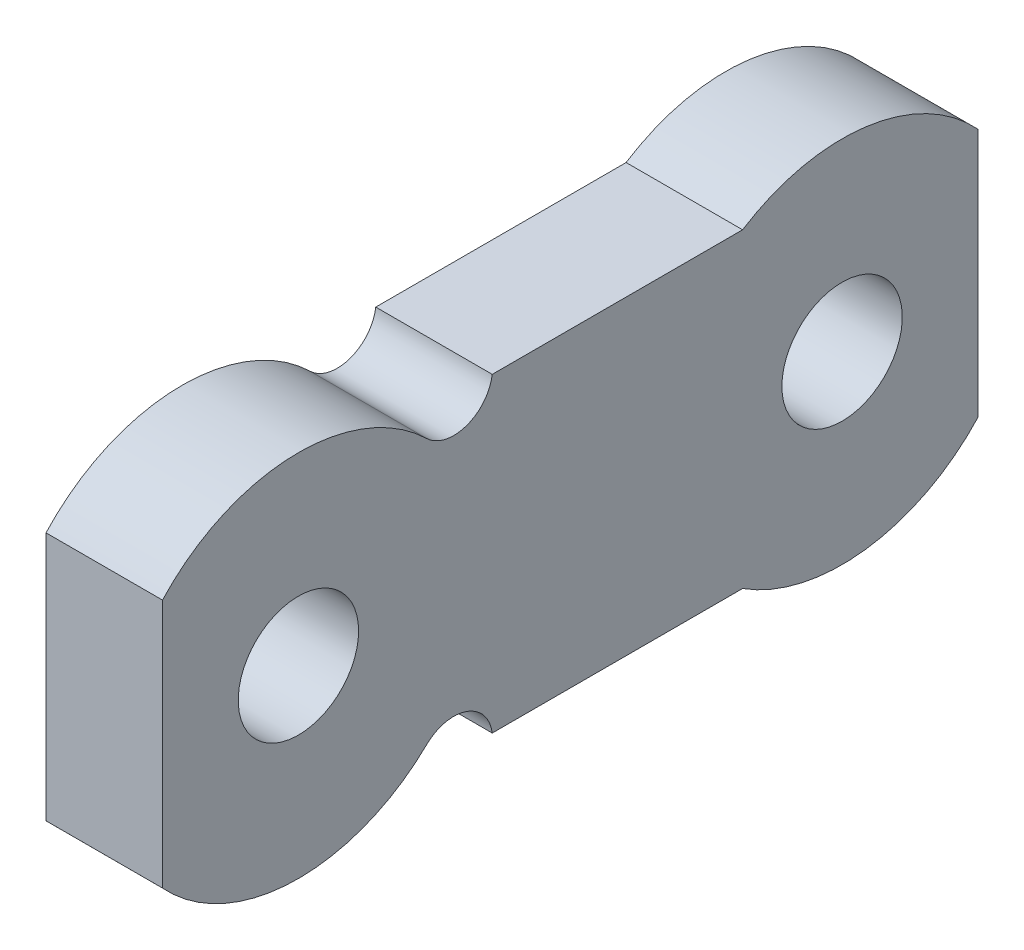
ISO-10303-21;
HEADER;
FILE_DESCRIPTION(('STEP AP214'),'2;1');
FILE_NAME('part.step','',(''),(''),'','','');
FILE_SCHEMA(('AUTOMOTIVE_DESIGN { 1 0 10303 214 1 1 1 1 }'));
ENDSEC;
DATA;
#1=APPLICATION_CONTEXT('core data for automotive mechanical design processes');
#2=APPLICATION_PROTOCOL_DEFINITION('international standard','automotive_design',2000,#1);
#3=PRODUCT_CONTEXT('',#1,'mechanical');
#4=PRODUCT('Part','Part','',(#3));
#5=PRODUCT_RELATED_PRODUCT_CATEGORY('part','',(#4));
#6=PRODUCT_DEFINITION_FORMATION('','',#4);
#7=PRODUCT_DEFINITION_CONTEXT('part definition',#1,'design');
#8=PRODUCT_DEFINITION('design','',#6,#7);
#9=PRODUCT_DEFINITION_SHAPE('','',#8);
#10=(LENGTH_UNIT() NAMED_UNIT(*) SI_UNIT(.MILLI.,.METRE.));
#11=(NAMED_UNIT(*) PLANE_ANGLE_UNIT() SI_UNIT($,.RADIAN.));
#12=(NAMED_UNIT(*) SI_UNIT($,.STERADIAN.) SOLID_ANGLE_UNIT());
#13=UNCERTAINTY_MEASURE_WITH_UNIT(LENGTH_MEASURE(1.E-05),#10,'distance_accuracy_value','');
#14=(GEOMETRIC_REPRESENTATION_CONTEXT(3) GLOBAL_UNCERTAINTY_ASSIGNED_CONTEXT((#13)) GLOBAL_UNIT_ASSIGNED_CONTEXT((#10,
#11,#12)) REPRESENTATION_CONTEXT('',''));
#15=CARTESIAN_POINT('',(0.,0.,0.));
#16=DIRECTION('',(0.,0.,1.));
#17=DIRECTION('',(1.,0.,0.));
#18=AXIS2_PLACEMENT_3D('',#15,#16,#17);
#19=CARTESIAN_POINT('',(3.,-4.13067791046458,3.));
#20=DIRECTION('',(-1.,0.,0.));
#21=DIRECTION('',(0.,0.,1.));
#22=AXIS2_PLACEMENT_3D('',#19,#20,#21);
#23=PLANE('',#22);
#24=CARTESIAN_POINT('',(3.,-4.13067791046458,3.));
#25=DIRECTION('',(-1.,0.,0.));
#26=DIRECTION('',(0.,0.,1.));
#27=AXIS2_PLACEMENT_3D('',#24,#25,#26);
#28=CIRCLE('',#27,1.);
#29=CARTESIAN_POINT('',(3.,-3.41229914342726,3.69565217391304));
#30=VERTEX_POINT('',#29);
#31=CARTESIAN_POINT('',(3.,-4.,2.00857512452198));
#32=VERTEX_POINT('',#31);
#33=EDGE_CURVE('E162',#30,#32,#28,.T.);
#34=ORIENTED_EDGE('',*,*,#33,.T.);
#35=DIRECTION('',(0.,0.,-1.));
#36=VECTOR('',#35,1.);
#37=CARTESIAN_POINT('',(3.,-4.,2.00857512452198));
#38=LINE('',#37,#36);
#39=CARTESIAN_POINT('',(3.,-4.,-4.4382623085101));
#40=VERTEX_POINT('',#39);
#41=EDGE_CURVE('E100',#32,#40,#38,.T.);
#42=ORIENTED_EDGE('',*,*,#41,.T.);
#43=CARTESIAN_POINT('',(3.,0.,-7.));
#44=DIRECTION('',(1.,0.,0.));
#45=DIRECTION('',(0.,0.,-1.));
#46=AXIS2_PLACEMENT_3D('',#43,#44,#45);
#47=CIRCLE('',#46,4.75);
#48=CARTESIAN_POINT('',(3.,-3.21130814466629,-10.5));
#49=VERTEX_POINT('',#48);
#50=EDGE_CURVE('E183',#40,#49,#47,.T.);
#51=ORIENTED_EDGE('',*,*,#50,.T.);
#52=DIRECTION('',(0.,1.,0.));
#53=VECTOR('',#52,1.);
#54=CARTESIAN_POINT('',(3.,3.21130814466628,-10.5));
#55=LINE('',#54,#53);
#56=CARTESIAN_POINT('',(3.,3.21130814466628,-10.5));
#57=VERTEX_POINT('',#56);
#58=EDGE_CURVE('E202',#49,#57,#55,.T.);
#59=ORIENTED_EDGE('',*,*,#58,.T.);
#60=CARTESIAN_POINT('',(3.,0.,-7.));
#61=DIRECTION('',(1.,0.,0.));
#62=DIRECTION('',(0.,0.,-1.));
#63=AXIS2_PLACEMENT_3D('',#60,#61,#62);
#64=CIRCLE('',#63,4.75);
#65=CARTESIAN_POINT('',(3.,4.,-4.4382623085101));
#66=VERTEX_POINT('',#65);
#67=EDGE_CURVE('E199',#57,#66,#64,.T.);
#68=ORIENTED_EDGE('',*,*,#67,.T.);
#69=DIRECTION('',(0.,0.,1.));
#70=VECTOR('',#69,1.);
#71=CARTESIAN_POINT('',(3.,4.,2.00857512452198));
#72=LINE('',#71,#70);
#73=CARTESIAN_POINT('',(3.,4.,2.00857512452198));
#74=VERTEX_POINT('',#73);
#75=EDGE_CURVE('E201',#66,#74,#72,.T.);
#76=ORIENTED_EDGE('',*,*,#75,.T.);
#77=CARTESIAN_POINT('',(3.,4.13067791046458,3.));
#78=DIRECTION('',(-1.,0.,0.));
#79=DIRECTION('',(0.,0.,-1.));
#80=AXIS2_PLACEMENT_3D('',#77,#78,#79);
#81=CIRCLE('',#80,1.);
#82=CARTESIAN_POINT('',(3.,3.41229914342726,3.69565217391304));
#83=VERTEX_POINT('',#82);
#84=EDGE_CURVE('E125',#74,#83,#81,.T.);
#85=ORIENTED_EDGE('',*,*,#84,.T.);
#86=CARTESIAN_POINT('',(3.,0.,7.));
#87=DIRECTION('',(1.,0.,0.));
#88=DIRECTION('',(0.,0.,-1.));
#89=AXIS2_PLACEMENT_3D('',#86,#87,#88);
#90=CIRCLE('',#89,4.75);
#91=CARTESIAN_POINT('',(3.,3.21130814466628,10.5));
#92=VERTEX_POINT('',#91);
#93=EDGE_CURVE('E119',#83,#92,#90,.T.);
#94=ORIENTED_EDGE('',*,*,#93,.T.);
#95=DIRECTION('',(0.,-1.,0.));
#96=VECTOR('',#95,1.);
#97=CARTESIAN_POINT('',(3.,3.21130814466628,10.5));
#98=LINE('',#97,#96);
#99=CARTESIAN_POINT('',(3.,-3.21130814466628,10.5));
#100=VERTEX_POINT('',#99);
#101=EDGE_CURVE('E123',#92,#100,#98,.T.);
#102=ORIENTED_EDGE('',*,*,#101,.T.);
#103=CARTESIAN_POINT('',(3.,0.,7.));
#104=DIRECTION('',(1.,0.,0.));
#105=DIRECTION('',(0.,0.,-1.));
#106=AXIS2_PLACEMENT_3D('',#103,#104,#105);
#107=CIRCLE('',#106,4.75);
#108=EDGE_CURVE('E51',#100,#30,#107,.T.);
#109=ORIENTED_EDGE('',*,*,#108,.T.);
#110=EDGE_LOOP('',(#34,#42,#51,#59,#68,#76,#85,#94,#102,#109));
#111=FACE_BOUND('',#110,.T.);
#112=CARTESIAN_POINT('',(3.,0.,7.));
#113=DIRECTION('',(1.,0.,0.));
#114=DIRECTION('',(0.,0.,-1.));
#115=AXIS2_PLACEMENT_3D('',#112,#113,#114);
#116=CIRCLE('',#115,1.55);
#117=CARTESIAN_POINT('',(3.,0.,5.45));
#118=VERTEX_POINT('',#117);
#119=EDGE_CURVE('E147',#118,#118,#116,.T.);
#120=ORIENTED_EDGE('',*,*,#119,.F.);
#121=EDGE_LOOP('',(#120));
#122=FACE_BOUND('',#121,.T.);
#123=CARTESIAN_POINT('',(3.,0.,-7.));
#124=DIRECTION('',(1.,0.,0.));
#125=DIRECTION('',(0.,0.,1.));
#126=AXIS2_PLACEMENT_3D('',#123,#124,#125);
#127=CIRCLE('',#126,1.55);
#128=CARTESIAN_POINT('',(3.,0.,-5.45));
#129=VERTEX_POINT('',#128);
#130=EDGE_CURVE('E213',#129,#129,#127,.T.);
#131=ORIENTED_EDGE('',*,*,#130,.F.);
#132=EDGE_LOOP('',(#131));
#133=FACE_BOUND('',#132,.T.);
#134=ADVANCED_FACE('F34',(#111,#122,#133),#23,.F.);
#135=CARTESIAN_POINT('',(0.,-4.13067791046458,3.));
#136=DIRECTION('',(-1.,0.,0.));
#137=DIRECTION('',(0.,0.,1.));
#138=AXIS2_PLACEMENT_3D('',#135,#136,#137);
#139=PLANE('',#138);
#140=CARTESIAN_POINT('',(0.,0.,7.));
#141=DIRECTION('',(1.,0.,0.));
#142=DIRECTION('',(0.,0.,-1.));
#143=AXIS2_PLACEMENT_3D('',#140,#141,#142);
#144=CIRCLE('',#143,1.55);
#145=CARTESIAN_POINT('',(0.,0.,5.45));
#146=VERTEX_POINT('',#145);
#147=EDGE_CURVE('E210',#146,#146,#144,.T.);
#148=ORIENTED_EDGE('',*,*,#147,.T.);
#149=EDGE_LOOP('',(#148));
#150=FACE_BOUND('',#149,.T.);
#151=CARTESIAN_POINT('',(0.,-4.13067791046458,3.));
#152=DIRECTION('',(-1.,0.,0.));
#153=DIRECTION('',(0.,0.,1.));
#154=AXIS2_PLACEMENT_3D('',#151,#152,#153);
#155=CIRCLE('',#154,1.);
#156=CARTESIAN_POINT('',(0.,-3.41229914342726,3.69565217391304));
#157=VERTEX_POINT('',#156);
#158=CARTESIAN_POINT('',(0.,-4.,2.00857512452198));
#159=VERTEX_POINT('',#158);
#160=EDGE_CURVE('E143',#157,#159,#155,.T.);
#161=ORIENTED_EDGE('',*,*,#160,.F.);
#162=CARTESIAN_POINT('',(0.,0.,7.));
#163=DIRECTION('',(1.,0.,0.));
#164=DIRECTION('',(0.,0.,-1.));
#165=AXIS2_PLACEMENT_3D('',#162,#163,#164);
#166=CIRCLE('',#165,4.75);
#167=CARTESIAN_POINT('',(0.,-3.21130814466628,10.5));
#168=VERTEX_POINT('',#167);
#169=EDGE_CURVE('E92',#168,#157,#166,.T.);
#170=ORIENTED_EDGE('',*,*,#169,.F.);
#171=DIRECTION('',(0.,-1.,0.));
#172=VECTOR('',#171,1.);
#173=CARTESIAN_POINT('',(0.,3.21130814466628,10.5));
#174=LINE('',#173,#172);
#175=CARTESIAN_POINT('',(0.,3.21130814466628,10.5));
#176=VERTEX_POINT('',#175);
#177=EDGE_CURVE('E86',#176,#168,#174,.T.);
#178=ORIENTED_EDGE('',*,*,#177,.F.);
#179=CARTESIAN_POINT('',(0.,0.,7.));
#180=DIRECTION('',(1.,0.,0.));
#181=DIRECTION('',(0.,0.,-1.));
#182=AXIS2_PLACEMENT_3D('',#179,#180,#181);
#183=CIRCLE('',#182,4.75);
#184=CARTESIAN_POINT('',(0.,3.41229914342726,3.69565217391304));
#185=VERTEX_POINT('',#184);
#186=EDGE_CURVE('E133',#185,#176,#183,.T.);
#187=ORIENTED_EDGE('',*,*,#186,.F.);
#188=CARTESIAN_POINT('',(0.,4.13067791046458,3.));
#189=DIRECTION('',(-1.,0.,0.));
#190=DIRECTION('',(0.,0.,-1.));
#191=AXIS2_PLACEMENT_3D('',#188,#189,#190);
#192=CIRCLE('',#191,1.);
#193=CARTESIAN_POINT('',(0.,4.,2.00857512452198));
#194=VERTEX_POINT('',#193);
#195=EDGE_CURVE('E157',#194,#185,#192,.T.);
#196=ORIENTED_EDGE('',*,*,#195,.F.);
#197=DIRECTION('',(0.,0.,1.));
#198=VECTOR('',#197,1.);
#199=CARTESIAN_POINT('',(0.,4.,2.00857512452198));
#200=LINE('',#199,#198);
#201=CARTESIAN_POINT('',(0.,4.,-4.4382623085101));
#202=VERTEX_POINT('',#201);
#203=EDGE_CURVE('E155',#202,#194,#200,.T.);
#204=ORIENTED_EDGE('',*,*,#203,.F.);
#205=CARTESIAN_POINT('',(0.,0.,-7.));
#206=DIRECTION('',(1.,0.,0.));
#207=DIRECTION('',(0.,0.,-1.));
#208=AXIS2_PLACEMENT_3D('',#205,#206,#207);
#209=CIRCLE('',#208,4.75);
#210=CARTESIAN_POINT('',(0.,3.21130814466628,-10.5));
#211=VERTEX_POINT('',#210);
#212=EDGE_CURVE('E153',#211,#202,#209,.T.);
#213=ORIENTED_EDGE('',*,*,#212,.F.);
#214=DIRECTION('',(0.,1.,0.));
#215=VECTOR('',#214,1.);
#216=CARTESIAN_POINT('',(0.,3.21130814466628,-10.5));
#217=LINE('',#216,#215);
#218=CARTESIAN_POINT('',(0.,-3.21130814466629,-10.5));
#219=VERTEX_POINT('',#218);
#220=EDGE_CURVE('E151',#219,#211,#217,.T.);
#221=ORIENTED_EDGE('',*,*,#220,.F.);
#222=CARTESIAN_POINT('',(0.,0.,-7.));
#223=DIRECTION('',(1.,0.,0.));
#224=DIRECTION('',(0.,0.,-1.));
#225=AXIS2_PLACEMENT_3D('',#222,#223,#224);
#226=CIRCLE('',#225,4.75);
#227=CARTESIAN_POINT('',(0.,-4.,-4.4382623085101));
#228=VERTEX_POINT('',#227);
#229=EDGE_CURVE('E149',#228,#219,#226,.T.);
#230=ORIENTED_EDGE('',*,*,#229,.F.);
#231=DIRECTION('',(0.,0.,-1.));
#232=VECTOR('',#231,1.);
#233=CARTESIAN_POINT('',(0.,-4.,2.00857512452198));
#234=LINE('',#233,#232);
#235=EDGE_CURVE('E146',#159,#228,#234,.T.);
#236=ORIENTED_EDGE('',*,*,#235,.F.);
#237=EDGE_LOOP('',(#161,#170,#178,#187,#196,#204,#213,#221,#230,#236));
#238=FACE_BOUND('',#237,.T.);
#239=CARTESIAN_POINT('',(0.,0.,-7.));
#240=DIRECTION('',(1.,0.,0.));
#241=DIRECTION('',(0.,0.,1.));
#242=AXIS2_PLACEMENT_3D('',#239,#240,#241);
#243=CIRCLE('',#242,1.55);
#244=CARTESIAN_POINT('',(0.,0.,-5.45));
#245=VERTEX_POINT('',#244);
#246=EDGE_CURVE('E216',#245,#245,#243,.T.);
#247=ORIENTED_EDGE('',*,*,#246,.T.);
#248=EDGE_LOOP('',(#247));
#249=FACE_BOUND('',#248,.T.);
#250=ADVANCED_FACE('F187',(#150,#238,#249),#139,.T.);
#251=CARTESIAN_POINT('',(3.,-4.13067791046458,3.));
#252=DIRECTION('',(-1.,0.,0.));
#253=DIRECTION('',(0.,0.,1.));
#254=AXIS2_PLACEMENT_3D('',#251,#252,#253);
#255=CYLINDRICAL_SURFACE('',#254,1.);
#256=ORIENTED_EDGE('',*,*,#160,.T.);
#257=DIRECTION('',(-1.,0.,0.));
#258=VECTOR('',#257,1.);
#259=CARTESIAN_POINT('',(3.,-4.,2.00857512452198));
#260=LINE('',#259,#258);
#261=EDGE_CURVE('E11',#32,#159,#260,.T.);
#262=ORIENTED_EDGE('',*,*,#261,.F.);
#263=ORIENTED_EDGE('',*,*,#33,.F.);
#264=DIRECTION('',(-1.,0.,0.));
#265=VECTOR('',#264,1.);
#266=CARTESIAN_POINT('',(3.,-3.41229914342726,3.69565217391304));
#267=LINE('',#266,#265);
#268=EDGE_CURVE('E139',#30,#157,#267,.T.);
#269=ORIENTED_EDGE('',*,*,#268,.T.);
#270=EDGE_LOOP('',(#256,#262,#263,#269));
#271=FACE_BOUND('',#270,.T.);
#272=ADVANCED_FACE('F36',(#271),#255,.F.);
#273=CARTESIAN_POINT('',(3.,-4.,2.00857512452198));
#274=DIRECTION('',(0.,1.,0.));
#275=DIRECTION('',(0.,0.,1.));
#276=AXIS2_PLACEMENT_3D('',#273,#274,#275);
#277=PLANE('',#276);
#278=ORIENTED_EDGE('',*,*,#235,.T.);
#279=DIRECTION('',(-1.,0.,0.));
#280=VECTOR('',#279,1.);
#281=CARTESIAN_POINT('',(3.,-4.,-4.4382623085101));
#282=LINE('',#281,#280);
#283=EDGE_CURVE('E43',#40,#228,#282,.T.);
#284=ORIENTED_EDGE('',*,*,#283,.F.);
#285=ORIENTED_EDGE('',*,*,#41,.F.);
#286=ORIENTED_EDGE('',*,*,#261,.T.);
#287=EDGE_LOOP('',(#278,#284,#285,#286));
#288=FACE_BOUND('',#287,.T.);
#289=ADVANCED_FACE('F256',(#288),#277,.F.);
#290=CARTESIAN_POINT('',(3.,0.,-7.));
#291=DIRECTION('',(-1.,0.,0.));
#292=DIRECTION('',(0.,0.,1.));
#293=AXIS2_PLACEMENT_3D('',#290,#291,#292);
#294=CYLINDRICAL_SURFACE('',#293,4.75);
#295=ORIENTED_EDGE('',*,*,#229,.T.);
#296=DIRECTION('',(-1.,0.,0.));
#297=VECTOR('',#296,1.);
#298=CARTESIAN_POINT('',(3.,-3.21130814466629,-10.5));
#299=LINE('',#298,#297);
#300=EDGE_CURVE('E175',#49,#219,#299,.T.);
#301=ORIENTED_EDGE('',*,*,#300,.F.);
#302=ORIENTED_EDGE('',*,*,#50,.F.);
#303=ORIENTED_EDGE('',*,*,#283,.T.);
#304=EDGE_LOOP('',(#295,#301,#302,#303));
#305=FACE_BOUND('',#304,.T.);
#306=ADVANCED_FACE('F181',(#305),#294,.T.);
#307=CARTESIAN_POINT('',(3.,3.21130814466628,-10.5));
#308=DIRECTION('',(0.,0.,1.));
#309=DIRECTION('',(1.,0.,0.));
#310=AXIS2_PLACEMENT_3D('',#307,#308,#309);
#311=PLANE('',#310);
#312=ORIENTED_EDGE('',*,*,#220,.T.);
#313=DIRECTION('',(-1.,0.,0.));
#314=VECTOR('',#313,1.);
#315=CARTESIAN_POINT('',(3.,3.21130814466628,-10.5));
#316=LINE('',#315,#314);
#317=EDGE_CURVE('E172',#57,#211,#316,.T.);
#318=ORIENTED_EDGE('',*,*,#317,.F.);
#319=ORIENTED_EDGE('',*,*,#58,.F.);
#320=ORIENTED_EDGE('',*,*,#300,.T.);
#321=EDGE_LOOP('',(#312,#318,#319,#320));
#322=FACE_BOUND('',#321,.T.);
#323=ADVANCED_FACE('F193',(#322),#311,.F.);
#324=CARTESIAN_POINT('',(3.,0.,-7.));
#325=DIRECTION('',(-1.,0.,0.));
#326=DIRECTION('',(0.,0.,1.));
#327=AXIS2_PLACEMENT_3D('',#324,#325,#326);
#328=CYLINDRICAL_SURFACE('',#327,4.75);
#329=ORIENTED_EDGE('',*,*,#212,.T.);
#330=DIRECTION('',(-1.,0.,0.));
#331=VECTOR('',#330,1.);
#332=CARTESIAN_POINT('',(3.,4.,-4.4382623085101));
#333=LINE('',#332,#331);
#334=EDGE_CURVE('E169',#66,#202,#333,.T.);
#335=ORIENTED_EDGE('',*,*,#334,.F.);
#336=ORIENTED_EDGE('',*,*,#67,.F.);
#337=ORIENTED_EDGE('',*,*,#317,.T.);
#338=EDGE_LOOP('',(#329,#335,#336,#337));
#339=FACE_BOUND('',#338,.T.);
#340=ADVANCED_FACE('F197',(#339),#328,.T.);
#341=CARTESIAN_POINT('',(3.,4.,2.00857512452198));
#342=DIRECTION('',(0.,-1.,0.));
#343=DIRECTION('',(0.,0.,-1.));
#344=AXIS2_PLACEMENT_3D('',#341,#342,#343);
#345=PLANE('',#344);
#346=ORIENTED_EDGE('',*,*,#203,.T.);
#347=DIRECTION('',(-1.,0.,0.));
#348=VECTOR('',#347,1.);
#349=CARTESIAN_POINT('',(3.,4.,2.00857512452198));
#350=LINE('',#349,#348);
#351=EDGE_CURVE('E166',#74,#194,#350,.T.);
#352=ORIENTED_EDGE('',*,*,#351,.F.);
#353=ORIENTED_EDGE('',*,*,#75,.F.);
#354=ORIENTED_EDGE('',*,*,#334,.T.);
#355=EDGE_LOOP('',(#346,#352,#353,#354));
#356=FACE_BOUND('',#355,.T.);
#357=ADVANCED_FACE('F246',(#356),#345,.F.);
#358=CARTESIAN_POINT('',(3.,4.13067791046458,3.));
#359=DIRECTION('',(-1.,0.,0.));
#360=DIRECTION('',(0.,0.,1.));
#361=AXIS2_PLACEMENT_3D('',#358,#359,#360);
#362=CYLINDRICAL_SURFACE('',#361,1.);
#363=ORIENTED_EDGE('',*,*,#195,.T.);
#364=DIRECTION('',(-1.,0.,0.));
#365=VECTOR('',#364,1.);
#366=CARTESIAN_POINT('',(3.,3.41229914342726,3.69565217391304));
#367=LINE('',#366,#365);
#368=EDGE_CURVE('E134',#83,#185,#367,.T.);
#369=ORIENTED_EDGE('',*,*,#368,.F.);
#370=ORIENTED_EDGE('',*,*,#84,.F.);
#371=ORIENTED_EDGE('',*,*,#351,.T.);
#372=EDGE_LOOP('',(#363,#369,#370,#371));
#373=FACE_BOUND('',#372,.T.);
#374=ADVANCED_FACE('F243',(#373),#362,.F.);
#375=CARTESIAN_POINT('',(3.,0.,7.));
#376=DIRECTION('',(-1.,0.,0.));
#377=DIRECTION('',(0.,0.,1.));
#378=AXIS2_PLACEMENT_3D('',#375,#376,#377);
#379=CYLINDRICAL_SURFACE('',#378,4.75);
#380=ORIENTED_EDGE('',*,*,#186,.T.);
#381=DIRECTION('',(-1.,0.,0.));
#382=VECTOR('',#381,1.);
#383=CARTESIAN_POINT('',(3.,3.21130814466628,10.5));
#384=LINE('',#383,#382);
#385=EDGE_CURVE('E130',#92,#176,#384,.T.);
#386=ORIENTED_EDGE('',*,*,#385,.F.);
#387=ORIENTED_EDGE('',*,*,#93,.F.);
#388=ORIENTED_EDGE('',*,*,#368,.T.);
#389=EDGE_LOOP('',(#380,#386,#387,#388));
#390=FACE_BOUND('',#389,.T.);
#391=ADVANCED_FACE('F131',(#390),#379,.T.);
#392=CARTESIAN_POINT('',(3.,3.21130814466628,10.5));
#393=DIRECTION('',(0.,0.,-1.));
#394=DIRECTION('',(-1.,0.,0.));
#395=AXIS2_PLACEMENT_3D('',#392,#393,#394);
#396=PLANE('',#395);
#397=ORIENTED_EDGE('',*,*,#177,.T.);
#398=DIRECTION('',(-1.,0.,0.));
#399=VECTOR('',#398,1.);
#400=CARTESIAN_POINT('',(3.,-3.21130814466628,10.5));
#401=LINE('',#400,#399);
#402=EDGE_CURVE('E135',#100,#168,#401,.T.);
#403=ORIENTED_EDGE('',*,*,#402,.F.);
#404=ORIENTED_EDGE('',*,*,#101,.F.);
#405=ORIENTED_EDGE('',*,*,#385,.T.);
#406=EDGE_LOOP('',(#397,#403,#404,#405));
#407=FACE_BOUND('',#406,.T.);
#408=ADVANCED_FACE('F137',(#407),#396,.F.);
#409=CARTESIAN_POINT('',(3.,0.,7.));
#410=DIRECTION('',(-1.,0.,0.));
#411=DIRECTION('',(0.,0.,1.));
#412=AXIS2_PLACEMENT_3D('',#409,#410,#411);
#413=CYLINDRICAL_SURFACE('',#412,4.75);
#414=ORIENTED_EDGE('',*,*,#169,.T.);
#415=ORIENTED_EDGE('',*,*,#268,.F.);
#416=ORIENTED_EDGE('',*,*,#108,.F.);
#417=ORIENTED_EDGE('',*,*,#402,.T.);
#418=EDGE_LOOP('',(#414,#415,#416,#417));
#419=FACE_BOUND('',#418,.T.);
#420=ADVANCED_FACE('F236',(#419),#413,.T.);
#421=CARTESIAN_POINT('',(3.,0.,7.));
#422=DIRECTION('',(-1.,0.,0.));
#423=DIRECTION('',(0.,0.,1.));
#424=AXIS2_PLACEMENT_3D('',#421,#422,#423);
#425=CYLINDRICAL_SURFACE('',#424,1.55);
#426=ORIENTED_EDGE('',*,*,#119,.T.);
#427=EDGE_LOOP('',(#426));
#428=FACE_BOUND('',#427,.T.);
#429=ORIENTED_EDGE('',*,*,#147,.F.);
#430=EDGE_LOOP('',(#429));
#431=FACE_BOUND('',#430,.T.);
#432=ADVANCED_FACE('F233',(#428,#431),#425,.F.);
#433=CARTESIAN_POINT('',(3.,0.,-7.));
#434=DIRECTION('',(-1.,0.,0.));
#435=DIRECTION('',(0.,0.,1.));
#436=AXIS2_PLACEMENT_3D('',#433,#434,#435);
#437=CYLINDRICAL_SURFACE('',#436,1.55);
#438=ORIENTED_EDGE('',*,*,#130,.T.);
#439=EDGE_LOOP('',(#438));
#440=FACE_BOUND('',#439,.T.);
#441=ORIENTED_EDGE('',*,*,#246,.F.);
#442=EDGE_LOOP('',(#441));
#443=FACE_BOUND('',#442,.T.);
#444=ADVANCED_FACE('F222',(#440,#443),#437,.F.);
#445=CLOSED_SHELL('',(#134,#250,#272,#289,#306,#323,#340,#357,#374,#391,#408,#420,#432,#444));
#446=MANIFOLD_SOLID_BREP('B2',#445);
#447=ADVANCED_BREP_SHAPE_REPRESENTATION('',(#18,#446),#14);
#448=SHAPE_DEFINITION_REPRESENTATION(#9,#447);
ENDSEC;
END-ISO-10303-21;
